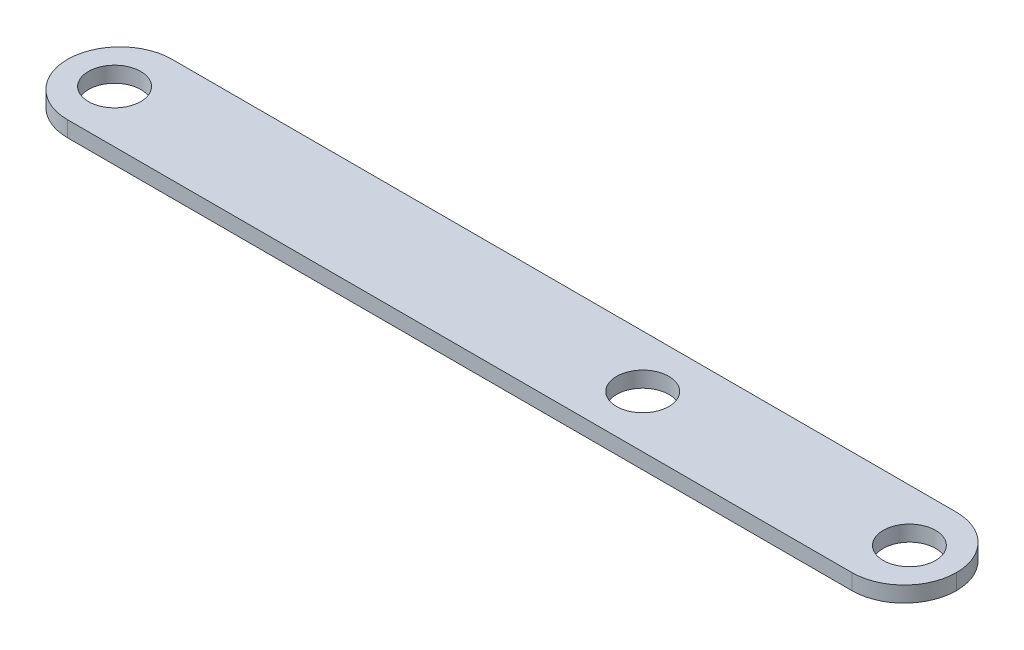
ISO-10303-21;
HEADER;
FILE_DESCRIPTION(('STEP AP214'),'2;1');
FILE_NAME('part.step','',(''),(''),'','','');
FILE_SCHEMA(('AUTOMOTIVE_DESIGN { 1 0 10303 214 1 1 1 1 }'));
ENDSEC;
DATA;
#1=APPLICATION_CONTEXT('core data for automotive mechanical design processes');
#2=APPLICATION_PROTOCOL_DEFINITION('international standard','automotive_design',2000,#1);
#3=PRODUCT_CONTEXT('',#1,'mechanical');
#4=PRODUCT('Part','Part','',(#3));
#5=PRODUCT_RELATED_PRODUCT_CATEGORY('part','',(#4));
#6=PRODUCT_DEFINITION_FORMATION('','',#4);
#7=PRODUCT_DEFINITION_CONTEXT('part definition',#1,'design');
#8=PRODUCT_DEFINITION('design','',#6,#7);
#9=PRODUCT_DEFINITION_SHAPE('','',#8);
#10=(LENGTH_UNIT() NAMED_UNIT(*) SI_UNIT(.MILLI.,.METRE.));
#11=(NAMED_UNIT(*) PLANE_ANGLE_UNIT() SI_UNIT($,.RADIAN.));
#12=(NAMED_UNIT(*) SI_UNIT($,.STERADIAN.) SOLID_ANGLE_UNIT());
#13=UNCERTAINTY_MEASURE_WITH_UNIT(LENGTH_MEASURE(1.E-05),#10,'distance_accuracy_value','');
#14=(GEOMETRIC_REPRESENTATION_CONTEXT(3) GLOBAL_UNCERTAINTY_ASSIGNED_CONTEXT((#13)) GLOBAL_UNIT_ASSIGNED_CONTEXT((#10,
#11,#12)) REPRESENTATION_CONTEXT('',''));
#15=CARTESIAN_POINT('',(0.,0.,0.));
#16=DIRECTION('',(0.,0.,1.));
#17=DIRECTION('',(1.,0.,0.));
#18=AXIS2_PLACEMENT_3D('',#15,#16,#17);
#19=CARTESIAN_POINT('',(0.,3.,0.));
#20=DIRECTION('',(0.,0.,-1.));
#21=DIRECTION('',(-1.,0.,0.));
#22=AXIS2_PLACEMENT_3D('',#19,#20,#21);
#23=PLANE('',#22);
#24=DIRECTION('',(1.,0.,0.));
#25=VECTOR('',#24,1.);
#26=CARTESIAN_POINT('',(0.,0.,0.));
#27=LINE('',#26,#25);
#28=CARTESIAN_POINT('',(10.,0.,0.));
#29=VERTEX_POINT('',#28);
#30=CARTESIAN_POINT('',(160.,0.,0.));
#31=VERTEX_POINT('',#30);
#32=EDGE_CURVE('E99',#29,#31,#27,.T.);
#33=ORIENTED_EDGE('',*,*,#32,.T.);
#34=DIRECTION('',(0.,-1.,0.));
#35=VECTOR('',#34,1.);
#36=CARTESIAN_POINT('',(160.,3.,0.));
#37=LINE('',#36,#35);
#38=CARTESIAN_POINT('',(160.,3.,0.));
#39=VERTEX_POINT('',#38);
#40=EDGE_CURVE('E11',#31,#39,#37,.F.);
#41=ORIENTED_EDGE('',*,*,#40,.T.);
#42=DIRECTION('',(1.,0.,0.));
#43=VECTOR('',#42,1.);
#44=CARTESIAN_POINT('',(0.,3.,0.));
#45=LINE('',#44,#43);
#46=CARTESIAN_POINT('',(10.,3.,0.));
#47=VERTEX_POINT('',#46);
#48=EDGE_CURVE('E141',#47,#39,#45,.T.);
#49=ORIENTED_EDGE('',*,*,#48,.F.);
#50=DIRECTION('',(0.,-1.,0.));
#51=VECTOR('',#50,1.);
#52=CARTESIAN_POINT('',(10.,3.,0.));
#53=LINE('',#52,#51);
#54=EDGE_CURVE('E123',#47,#29,#53,.T.);
#55=ORIENTED_EDGE('',*,*,#54,.T.);
#56=EDGE_LOOP('',(#33,#41,#49,#55));
#57=FACE_BOUND('',#56,.T.);
#58=ADVANCED_FACE('F37',(#57),#23,.F.);
#59=CARTESIAN_POINT('',(0.,3.,-20.));
#60=DIRECTION('',(0.,0.,1.));
#61=DIRECTION('',(1.,0.,0.));
#62=AXIS2_PLACEMENT_3D('',#59,#60,#61);
#63=PLANE('',#62);
#64=DIRECTION('',(-1.,0.,0.));
#65=VECTOR('',#64,1.);
#66=CARTESIAN_POINT('',(0.,3.,-20.));
#67=LINE('',#66,#65);
#68=CARTESIAN_POINT('',(160.,3.,-20.));
#69=VERTEX_POINT('',#68);
#70=CARTESIAN_POINT('',(10.,3.,-20.));
#71=VERTEX_POINT('',#70);
#72=EDGE_CURVE('E102',#69,#71,#67,.T.);
#73=ORIENTED_EDGE('',*,*,#72,.F.);
#74=DIRECTION('',(0.,-1.,0.));
#75=VECTOR('',#74,1.);
#76=CARTESIAN_POINT('',(160.,3.,-20.));
#77=LINE('',#76,#75);
#78=CARTESIAN_POINT('',(160.,0.,-20.));
#79=VERTEX_POINT('',#78);
#80=EDGE_CURVE('E124',#69,#79,#77,.T.);
#81=ORIENTED_EDGE('',*,*,#80,.T.);
#82=DIRECTION('',(-1.,0.,0.));
#83=VECTOR('',#82,1.);
#84=CARTESIAN_POINT('',(0.,0.,-20.));
#85=LINE('',#84,#83);
#86=CARTESIAN_POINT('',(10.,0.,-20.));
#87=VERTEX_POINT('',#86);
#88=EDGE_CURVE('E145',#79,#87,#85,.T.);
#89=ORIENTED_EDGE('',*,*,#88,.T.);
#90=DIRECTION('',(0.,-1.,0.));
#91=VECTOR('',#90,1.);
#92=CARTESIAN_POINT('',(10.,3.,-20.));
#93=LINE('',#92,#91);
#94=EDGE_CURVE('E115',#87,#71,#93,.F.);
#95=ORIENTED_EDGE('',*,*,#94,.T.);
#96=EDGE_LOOP('',(#73,#81,#89,#95));
#97=FACE_BOUND('',#96,.T.);
#98=ADVANCED_FACE('F140',(#97),#63,.F.);
#99=CARTESIAN_POINT('',(0.,3.,0.));
#100=DIRECTION('',(0.,-1.,0.));
#101=DIRECTION('',(0.,0.,-1.));
#102=AXIS2_PLACEMENT_3D('',#99,#100,#101);
#103=PLANE('',#102);
#104=CARTESIAN_POINT('',(110.,3.,-10.));
#105=DIRECTION('',(0.,1.,0.));
#106=DIRECTION('',(0.,0.,1.));
#107=AXIS2_PLACEMENT_3D('',#104,#105,#106);
#108=CIRCLE('',#107,4.99999999999999);
#109=CARTESIAN_POINT('',(110.,3.,-5.00000000000001));
#110=VERTEX_POINT('',#109);
#111=EDGE_CURVE('E149',#110,#110,#108,.T.);
#112=ORIENTED_EDGE('',*,*,#111,.F.);
#113=EDGE_LOOP('',(#112));
#114=FACE_BOUND('',#113,.T.);
#115=CARTESIAN_POINT('',(161.,3.,-10.));
#116=DIRECTION('',(0.,1.,0.));
#117=DIRECTION('',(0.,0.,1.));
#118=AXIS2_PLACEMENT_3D('',#115,#116,#117);
#119=CIRCLE('',#118,4.99999999999999);
#120=CARTESIAN_POINT('',(161.,3.,-5.00000000000001));
#121=VERTEX_POINT('',#120);
#122=EDGE_CURVE('E111',#121,#121,#119,.T.);
#123=ORIENTED_EDGE('',*,*,#122,.F.);
#124=EDGE_LOOP('',(#123));
#125=FACE_BOUND('',#124,.T.);
#126=CARTESIAN_POINT('',(9.,3.,-10.));
#127=DIRECTION('',(0.,1.,0.));
#128=DIRECTION('',(0.,0.,1.));
#129=AXIS2_PLACEMENT_3D('',#126,#127,#128);
#130=CIRCLE('',#129,5.);
#131=CARTESIAN_POINT('',(9.,3.,-5.));
#132=VERTEX_POINT('',#131);
#133=EDGE_CURVE('E159',#132,#132,#130,.T.);
#134=ORIENTED_EDGE('',*,*,#133,.F.);
#135=EDGE_LOOP('',(#134));
#136=FACE_BOUND('',#135,.T.);
#137=CARTESIAN_POINT('',(160.,3.,-10.));
#138=DIRECTION('',(0.,-1.,0.));
#139=DIRECTION('',(0.,0.,-1.));
#140=AXIS2_PLACEMENT_3D('',#137,#138,#139);
#141=CIRCLE('',#140,10.);
#142=CARTESIAN_POINT('',(170.,3.,-10.));
#143=VERTEX_POINT('',#142);
#144=EDGE_CURVE('E53',#39,#143,#141,.F.);
#145=ORIENTED_EDGE('',*,*,#144,.T.);
#146=CARTESIAN_POINT('',(160.,3.,-10.));
#147=DIRECTION('',(0.,-1.,0.));
#148=DIRECTION('',(0.,0.,-1.));
#149=AXIS2_PLACEMENT_3D('',#146,#147,#148);
#150=CIRCLE('',#149,10.);
#151=EDGE_CURVE('E46',#143,#69,#150,.F.);
#152=ORIENTED_EDGE('',*,*,#151,.T.);
#153=ORIENTED_EDGE('',*,*,#72,.T.);
#154=CARTESIAN_POINT('',(10.,3.,-10.));
#155=DIRECTION('',(0.,-1.,0.));
#156=DIRECTION('',(0.,0.,-1.));
#157=AXIS2_PLACEMENT_3D('',#154,#155,#156);
#158=CIRCLE('',#157,10.);
#159=CARTESIAN_POINT('',(0.,3.,-10.));
#160=VERTEX_POINT('',#159);
#161=EDGE_CURVE('E121',#71,#160,#158,.F.);
#162=ORIENTED_EDGE('',*,*,#161,.T.);
#163=CARTESIAN_POINT('',(10.,3.,-10.));
#164=DIRECTION('',(0.,-1.,0.));
#165=DIRECTION('',(0.,0.,-1.));
#166=AXIS2_PLACEMENT_3D('',#163,#164,#165);
#167=CIRCLE('',#166,10.);
#168=EDGE_CURVE('E108',#160,#47,#167,.F.);
#169=ORIENTED_EDGE('',*,*,#168,.T.);
#170=ORIENTED_EDGE('',*,*,#48,.T.);
#171=EDGE_LOOP('',(#145,#152,#153,#162,#169,#170));
#172=FACE_BOUND('',#171,.T.);
#173=ADVANCED_FACE('F135',(#114,#125,#136,#172),#103,.F.);
#174=CARTESIAN_POINT('',(0.,0.,0.));
#175=DIRECTION('',(0.,-1.,0.));
#176=DIRECTION('',(0.,0.,-1.));
#177=AXIS2_PLACEMENT_3D('',#174,#175,#176);
#178=PLANE('',#177);
#179=CARTESIAN_POINT('',(110.,0.,-10.));
#180=DIRECTION('',(0.,1.,0.));
#181=DIRECTION('',(0.,0.,1.));
#182=AXIS2_PLACEMENT_3D('',#179,#180,#181);
#183=CIRCLE('',#182,4.99999999999999);
#184=CARTESIAN_POINT('',(110.,0.,-5.00000000000001));
#185=VERTEX_POINT('',#184);
#186=EDGE_CURVE('E147',#185,#185,#183,.T.);
#187=ORIENTED_EDGE('',*,*,#186,.T.);
#188=EDGE_LOOP('',(#187));
#189=FACE_BOUND('',#188,.T.);
#190=CARTESIAN_POINT('',(161.,0.,-10.));
#191=DIRECTION('',(0.,1.,0.));
#192=DIRECTION('',(0.,0.,1.));
#193=AXIS2_PLACEMENT_3D('',#190,#191,#192);
#194=CIRCLE('',#193,4.99999999999999);
#195=CARTESIAN_POINT('',(161.,0.,-5.00000000000001));
#196=VERTEX_POINT('',#195);
#197=EDGE_CURVE('E156',#196,#196,#194,.T.);
#198=ORIENTED_EDGE('',*,*,#197,.T.);
#199=EDGE_LOOP('',(#198));
#200=FACE_BOUND('',#199,.T.);
#201=CARTESIAN_POINT('',(9.,0.,-10.));
#202=DIRECTION('',(0.,1.,0.));
#203=DIRECTION('',(0.,0.,1.));
#204=AXIS2_PLACEMENT_3D('',#201,#202,#203);
#205=CIRCLE('',#204,5.);
#206=CARTESIAN_POINT('',(9.,0.,-5.));
#207=VERTEX_POINT('',#206);
#208=EDGE_CURVE('E162',#207,#207,#205,.T.);
#209=ORIENTED_EDGE('',*,*,#208,.T.);
#210=EDGE_LOOP('',(#209));
#211=FACE_BOUND('',#210,.T.);
#212=ORIENTED_EDGE('',*,*,#88,.F.);
#213=CARTESIAN_POINT('',(160.,0.,-10.));
#214=DIRECTION('',(0.,-1.,0.));
#215=DIRECTION('',(0.,0.,-1.));
#216=AXIS2_PLACEMENT_3D('',#213,#214,#215);
#217=CIRCLE('',#216,10.);
#218=CARTESIAN_POINT('',(170.,0.,-10.));
#219=VERTEX_POINT('',#218);
#220=EDGE_CURVE('E130',#79,#219,#217,.T.);
#221=ORIENTED_EDGE('',*,*,#220,.T.);
#222=CARTESIAN_POINT('',(160.,0.,-10.));
#223=DIRECTION('',(0.,-1.,0.));
#224=DIRECTION('',(0.,0.,-1.));
#225=AXIS2_PLACEMENT_3D('',#222,#223,#224);
#226=CIRCLE('',#225,10.);
#227=EDGE_CURVE('E128',#219,#31,#226,.T.);
#228=ORIENTED_EDGE('',*,*,#227,.T.);
#229=ORIENTED_EDGE('',*,*,#32,.F.);
#230=CARTESIAN_POINT('',(10.,0.,-10.));
#231=DIRECTION('',(0.,-1.,0.));
#232=DIRECTION('',(0.,0.,-1.));
#233=AXIS2_PLACEMENT_3D('',#230,#231,#232);
#234=CIRCLE('',#233,10.);
#235=CARTESIAN_POINT('',(0.,0.,-10.));
#236=VERTEX_POINT('',#235);
#237=EDGE_CURVE('E92',#29,#236,#234,.T.);
#238=ORIENTED_EDGE('',*,*,#237,.T.);
#239=CARTESIAN_POINT('',(10.,0.,-10.));
#240=DIRECTION('',(0.,-1.,0.));
#241=DIRECTION('',(0.,0.,-1.));
#242=AXIS2_PLACEMENT_3D('',#239,#240,#241);
#243=CIRCLE('',#242,10.);
#244=EDGE_CURVE('E97',#236,#87,#243,.T.);
#245=ORIENTED_EDGE('',*,*,#244,.T.);
#246=EDGE_LOOP('',(#212,#221,#228,#229,#238,#245));
#247=FACE_BOUND('',#246,.T.);
#248=ADVANCED_FACE('F95',(#189,#200,#211,#247),#178,.T.);
#249=CARTESIAN_POINT('',(9.,0.,-10.));
#250=DIRECTION('',(0.,1.,0.));
#251=DIRECTION('',(0.,0.,1.));
#252=AXIS2_PLACEMENT_3D('',#249,#250,#251);
#253=CYLINDRICAL_SURFACE('',#252,5.);
#254=ORIENTED_EDGE('',*,*,#208,.F.);
#255=EDGE_LOOP('',(#254));
#256=FACE_BOUND('',#255,.T.);
#257=ORIENTED_EDGE('',*,*,#133,.T.);
#258=EDGE_LOOP('',(#257));
#259=FACE_BOUND('',#258,.T.);
#260=ADVANCED_FACE('F205',(#256,#259),#253,.F.);
#261=CARTESIAN_POINT('',(161.,0.,-10.));
#262=DIRECTION('',(0.,1.,0.));
#263=DIRECTION('',(0.,0.,1.));
#264=AXIS2_PLACEMENT_3D('',#261,#262,#263);
#265=CYLINDRICAL_SURFACE('',#264,4.99999999999999);
#266=ORIENTED_EDGE('',*,*,#197,.F.);
#267=EDGE_LOOP('',(#266));
#268=FACE_BOUND('',#267,.T.);
#269=ORIENTED_EDGE('',*,*,#122,.T.);
#270=EDGE_LOOP('',(#269));
#271=FACE_BOUND('',#270,.T.);
#272=ADVANCED_FACE('F179',(#268,#271),#265,.F.);
#273=CARTESIAN_POINT('',(10.,3.,-10.));
#274=DIRECTION('',(0.,-1.,0.));
#275=DIRECTION('',(0.,0.,-1.));
#276=AXIS2_PLACEMENT_3D('',#273,#274,#275);
#277=CYLINDRICAL_SURFACE('',#276,10.);
#278=ORIENTED_EDGE('',*,*,#54,.F.);
#279=ORIENTED_EDGE('',*,*,#168,.F.);
#280=DIRECTION('',(0.,-1.,0.));
#281=VECTOR('',#280,1.);
#282=CARTESIAN_POINT('',(0.,3.,-10.));
#283=LINE('',#282,#281);
#284=EDGE_CURVE('E106',#236,#160,#283,.F.);
#285=ORIENTED_EDGE('',*,*,#284,.F.);
#286=ORIENTED_EDGE('',*,*,#237,.F.);
#287=EDGE_LOOP('',(#278,#279,#285,#286));
#288=FACE_BOUND('',#287,.T.);
#289=ADVANCED_FACE('F107',(#288),#277,.T.);
#290=CARTESIAN_POINT('',(10.,3.,-10.));
#291=DIRECTION('',(0.,-1.,0.));
#292=DIRECTION('',(0.,0.,-1.));
#293=AXIS2_PLACEMENT_3D('',#290,#291,#292);
#294=CYLINDRICAL_SURFACE('',#293,10.);
#295=ORIENTED_EDGE('',*,*,#161,.F.);
#296=ORIENTED_EDGE('',*,*,#94,.F.);
#297=ORIENTED_EDGE('',*,*,#244,.F.);
#298=ORIENTED_EDGE('',*,*,#284,.T.);
#299=EDGE_LOOP('',(#295,#296,#297,#298));
#300=FACE_BOUND('',#299,.T.);
#301=ADVANCED_FACE('F113',(#300),#294,.T.);
#302=CARTESIAN_POINT('',(160.,3.,-10.));
#303=DIRECTION('',(0.,-1.,0.));
#304=DIRECTION('',(0.,0.,-1.));
#305=AXIS2_PLACEMENT_3D('',#302,#303,#304);
#306=CYLINDRICAL_SURFACE('',#305,10.);
#307=DIRECTION('',(0.,-1.,0.));
#308=VECTOR('',#307,1.);
#309=CARTESIAN_POINT('',(170.,3.,-10.));
#310=LINE('',#309,#308);
#311=EDGE_CURVE('E41',#143,#219,#310,.T.);
#312=ORIENTED_EDGE('',*,*,#311,.F.);
#313=ORIENTED_EDGE('',*,*,#144,.F.);
#314=ORIENTED_EDGE('',*,*,#40,.F.);
#315=ORIENTED_EDGE('',*,*,#227,.F.);
#316=EDGE_LOOP('',(#312,#313,#314,#315));
#317=FACE_BOUND('',#316,.T.);
#318=ADVANCED_FACE('F39',(#317),#306,.T.);
#319=CARTESIAN_POINT('',(160.,3.,-10.));
#320=DIRECTION('',(0.,-1.,0.));
#321=DIRECTION('',(0.,0.,-1.));
#322=AXIS2_PLACEMENT_3D('',#319,#320,#321);
#323=CYLINDRICAL_SURFACE('',#322,10.);
#324=ORIENTED_EDGE('',*,*,#151,.F.);
#325=ORIENTED_EDGE('',*,*,#311,.T.);
#326=ORIENTED_EDGE('',*,*,#220,.F.);
#327=ORIENTED_EDGE('',*,*,#80,.F.);
#328=EDGE_LOOP('',(#324,#325,#326,#327));
#329=FACE_BOUND('',#328,.T.);
#330=ADVANCED_FACE('F143',(#329),#323,.T.);
#331=CARTESIAN_POINT('',(110.,0.,-10.));
#332=DIRECTION('',(0.,1.,0.));
#333=DIRECTION('',(0.,0.,1.));
#334=AXIS2_PLACEMENT_3D('',#331,#332,#333);
#335=CYLINDRICAL_SURFACE('',#334,4.99999999999999);
#336=ORIENTED_EDGE('',*,*,#186,.F.);
#337=EDGE_LOOP('',(#336));
#338=FACE_BOUND('',#337,.T.);
#339=ORIENTED_EDGE('',*,*,#111,.T.);
#340=EDGE_LOOP('',(#339));
#341=FACE_BOUND('',#340,.T.);
#342=ADVANCED_FACE('F181',(#338,#341),#335,.F.);
#343=CLOSED_SHELL('',(#58,#98,#173,#248,#260,#272,#289,#301,#318,#330,#342));
#344=MANIFOLD_SOLID_BREP('B2',#343);
#345=ADVANCED_BREP_SHAPE_REPRESENTATION('',(#18,#344),#14);
#346=SHAPE_DEFINITION_REPRESENTATION(#9,#345);
ENDSEC;
END-ISO-10303-21;
